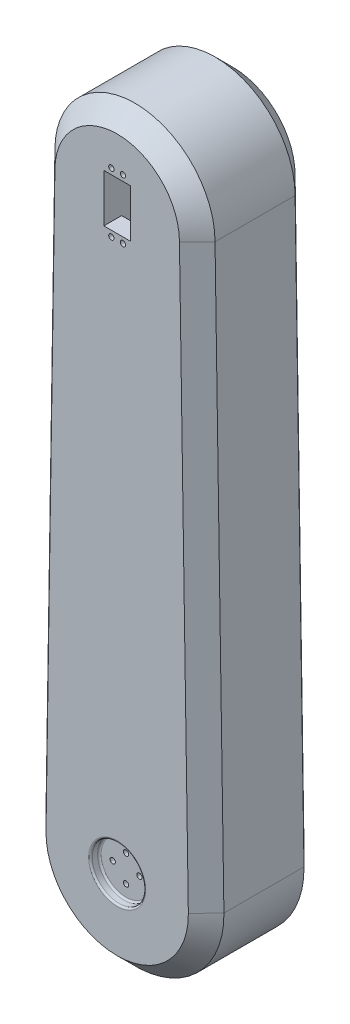
ISO-10303-21;
HEADER;
FILE_DESCRIPTION(('STEP AP214'),'2;1');
FILE_NAME('part.step','',(''),(''),'','','');
FILE_SCHEMA(('AUTOMOTIVE_DESIGN { 1 0 10303 214 1 1 1 1 }'));
ENDSEC;
DATA;
#1=APPLICATION_CONTEXT('core data for automotive mechanical design processes');
#2=APPLICATION_PROTOCOL_DEFINITION('international standard','automotive_design',2000,#1);
#3=PRODUCT_CONTEXT('',#1,'mechanical');
#4=PRODUCT('Part','Part','',(#3));
#5=PRODUCT_RELATED_PRODUCT_CATEGORY('part','',(#4));
#6=PRODUCT_DEFINITION_FORMATION('','',#4);
#7=PRODUCT_DEFINITION_CONTEXT('part definition',#1,'design');
#8=PRODUCT_DEFINITION('design','',#6,#7);
#9=PRODUCT_DEFINITION_SHAPE('','',#8);
#10=(LENGTH_UNIT() NAMED_UNIT(*) SI_UNIT(.MILLI.,.METRE.));
#11=(NAMED_UNIT(*) PLANE_ANGLE_UNIT() SI_UNIT($,.RADIAN.));
#12=(NAMED_UNIT(*) SI_UNIT($,.STERADIAN.) SOLID_ANGLE_UNIT());
#13=UNCERTAINTY_MEASURE_WITH_UNIT(LENGTH_MEASURE(1.E-05),#10,'distance_accuracy_value','');
#14=(GEOMETRIC_REPRESENTATION_CONTEXT(3) GLOBAL_UNCERTAINTY_ASSIGNED_CONTEXT((#13)) GLOBAL_UNIT_ASSIGNED_CONTEXT((#10,
#11,#12)) REPRESENTATION_CONTEXT('',''));
#15=CARTESIAN_POINT('',(0.,0.,0.));
#16=DIRECTION('',(0.,0.,1.));
#17=DIRECTION('',(1.,0.,0.));
#18=AXIS2_PLACEMENT_3D('',#15,#16,#17);
#19=CARTESIAN_POINT('',(0.,325.,65.));
#20=DIRECTION('',(0.,0.,1.));
#21=DIRECTION('',(1.,0.,0.));
#22=AXIS2_PLACEMENT_3D('',#19,#20,#21);
#23=PLANE('',#22);
#24=CARTESIAN_POINT('',(-3.25,308.25,65.));
#25=DIRECTION('',(0.,0.,-1.));
#26=DIRECTION('',(-1.,0.,0.));
#27=AXIS2_PLACEMENT_3D('',#24,#25,#26);
#28=CIRCLE('',#27,1.5);
#29=CARTESIAN_POINT('',(-4.75000000000001,308.25,65.));
#30=VERTEX_POINT('',#29);
#31=EDGE_CURVE('E719',#30,#30,#28,.T.);
#32=ORIENTED_EDGE('',*,*,#31,.T.);
#33=EDGE_LOOP('',(#32));
#34=FACE_BOUND('',#33,.T.);
#35=CARTESIAN_POINT('',(-3.25,341.75,65.));
#36=DIRECTION('',(0.,0.,-1.));
#37=DIRECTION('',(-1.,0.,0.));
#38=AXIS2_PLACEMENT_3D('',#35,#36,#37);
#39=CIRCLE('',#38,1.5);
#40=CARTESIAN_POINT('',(-4.75000000000001,341.75,65.));
#41=VERTEX_POINT('',#40);
#42=EDGE_CURVE('E707',#41,#41,#39,.F.);
#43=ORIENTED_EDGE('',*,*,#42,.F.);
#44=EDGE_LOOP('',(#43));
#45=FACE_BOUND('',#44,.T.);
#46=CARTESIAN_POINT('',(3.25,341.75,65.));
#47=DIRECTION('',(0.,0.,-1.));
#48=DIRECTION('',(-1.,0.,0.));
#49=AXIS2_PLACEMENT_3D('',#46,#47,#48);
#50=CIRCLE('',#49,1.5);
#51=CARTESIAN_POINT('',(1.74999999999999,341.75,65.));
#52=VERTEX_POINT('',#51);
#53=EDGE_CURVE('E183',#52,#52,#50,.T.);
#54=ORIENTED_EDGE('',*,*,#53,.T.);
#55=EDGE_LOOP('',(#54));
#56=FACE_BOUND('',#55,.T.);
#57=CARTESIAN_POINT('',(0.,0.,65.));
#58=DIRECTION('',(0.,0.,1.));
#59=DIRECTION('',(1.,0.,0.));
#60=AXIS2_PLACEMENT_3D('',#57,#58,#59);
#61=CIRCLE('',#60,16.);
#62=CARTESIAN_POINT('',(16.,0.,65.));
#63=VERTEX_POINT('',#62);
#64=EDGE_CURVE('E49',#63,#63,#61,.F.);
#65=ORIENTED_EDGE('',*,*,#64,.T.);
#66=EDGE_LOOP('',(#65));
#67=FACE_BOUND('',#66,.T.);
#68=DIRECTION('',(-0.0154010373396947,-0.999881396991094,0.));
#69=VECTOR('',#68,1.);
#70=CARTESIAN_POINT('',(-39.9952558796438,0.616041493587782,65.));
#71=LINE('',#70,#69);
#72=CARTESIAN_POINT('',(-34.9999255762725,324.927822057446,65.));
#73=VERTEX_POINT('',#72);
#74=CARTESIAN_POINT('',(-39.9952558796438,0.616041493587784,65.));
#75=VERTEX_POINT('',#74);
#76=EDGE_CURVE('E291',#73,#75,#71,.T.);
#77=ORIENTED_EDGE('',*,*,#76,.T.);
#78=CARTESIAN_POINT('',(0.,0.,65.));
#79=DIRECTION('',(0.,0.,1.));
#80=DIRECTION('',(1.,0.,0.));
#81=AXIS2_PLACEMENT_3D('',#78,#79,#80);
#82=CIRCLE('',#81,40.);
#83=CARTESIAN_POINT('',(39.9952558796438,0.616041493587789,65.));
#84=VERTEX_POINT('',#83);
#85=EDGE_CURVE('E293',#75,#84,#82,.T.);
#86=ORIENTED_EDGE('',*,*,#85,.T.);
#87=DIRECTION('',(-0.0154010373396947,0.999881396991094,0.));
#88=VECTOR('',#87,1.);
#89=CARTESIAN_POINT('',(35.0011860300891,324.845989626603,65.));
#90=LINE('',#89,#88);
#91=CARTESIAN_POINT('',(34.9999255762725,324.927822057446,65.));
#92=VERTEX_POINT('',#91);
#93=EDGE_CURVE('E287',#84,#92,#90,.T.);
#94=ORIENTED_EDGE('',*,*,#93,.T.);
#95=CARTESIAN_POINT('',(0.,325.,65.));
#96=DIRECTION('',(0.,0.,1.));
#97=DIRECTION('',(1.,0.,0.));
#98=AXIS2_PLACEMENT_3D('',#95,#96,#97);
#99=CIRCLE('',#98,35.);
#100=EDGE_CURVE('E289',#92,#73,#99,.T.);
#101=ORIENTED_EDGE('',*,*,#100,.T.);
#102=EDGE_LOOP('',(#77,#86,#94,#101));
#103=FACE_BOUND('',#102,.T.);
#104=DIRECTION('',(0.,-1.,0.));
#105=VECTOR('',#104,1.);
#106=CARTESIAN_POINT('',(7.49999999999996,0.,65.));
#107=LINE('',#106,#105);
#108=CARTESIAN_POINT('',(7.5,338.5,65.));
#109=VERTEX_POINT('',#108);
#110=CARTESIAN_POINT('',(7.5,311.5,65.));
#111=VERTEX_POINT('',#110);
#112=EDGE_CURVE('E161',#109,#111,#107,.T.);
#113=ORIENTED_EDGE('',*,*,#112,.T.);
#114=DIRECTION('',(1.,0.,0.));
#115=VECTOR('',#114,1.);
#116=CARTESIAN_POINT('',(0.,311.5,65.));
#117=LINE('',#116,#115);
#118=CARTESIAN_POINT('',(-7.5,311.5,65.));
#119=VERTEX_POINT('',#118);
#120=EDGE_CURVE('E156',#119,#111,#117,.T.);
#121=ORIENTED_EDGE('',*,*,#120,.F.);
#122=DIRECTION('',(0.,1.,0.));
#123=VECTOR('',#122,1.);
#124=CARTESIAN_POINT('',(-7.50000000000003,0.,65.));
#125=LINE('',#124,#123);
#126=CARTESIAN_POINT('',(-7.5,338.5,65.));
#127=VERTEX_POINT('',#126);
#128=EDGE_CURVE('E164',#119,#127,#125,.T.);
#129=ORIENTED_EDGE('',*,*,#128,.T.);
#130=DIRECTION('',(-1.,0.,0.));
#131=VECTOR('',#130,1.);
#132=CARTESIAN_POINT('',(0.,338.5,65.));
#133=LINE('',#132,#131);
#134=EDGE_CURVE('E169',#109,#127,#133,.T.);
#135=ORIENTED_EDGE('',*,*,#134,.F.);
#136=EDGE_LOOP('',(#113,#121,#129,#135));
#137=FACE_BOUND('',#136,.T.);
#138=CARTESIAN_POINT('',(3.25,308.25,65.));
#139=DIRECTION('',(0.,0.,-1.));
#140=DIRECTION('',(-1.,0.,0.));
#141=AXIS2_PLACEMENT_3D('',#138,#139,#140);
#142=CIRCLE('',#141,1.5);
#143=CARTESIAN_POINT('',(1.74999999999999,308.25,65.));
#144=VERTEX_POINT('',#143);
#145=EDGE_CURVE('E708',#144,#144,#142,.F.);
#146=ORIENTED_EDGE('',*,*,#145,.F.);
#147=EDGE_LOOP('',(#146));
#148=FACE_BOUND('',#147,.T.);
#149=ADVANCED_FACE('F41',(#34,#45,#56,#67,#103,#137,#148),#23,.T.);
#150=CARTESIAN_POINT('',(0.,325.,55.));
#151=DIRECTION('',(0.,0.,1.));
#152=DIRECTION('',(1.,0.,0.));
#153=AXIS2_PLACEMENT_3D('',#150,#151,#152);
#154=PLANE('',#153);
#155=CARTESIAN_POINT('',(3.25,308.25,55.));
#156=DIRECTION('',(0.,0.,-1.));
#157=DIRECTION('',(-1.,0.,0.));
#158=AXIS2_PLACEMENT_3D('',#155,#156,#157);
#159=CIRCLE('',#158,1.5);
#160=CARTESIAN_POINT('',(1.74999999999999,308.25,55.));
#161=VERTEX_POINT('',#160);
#162=EDGE_CURVE('E714',#161,#161,#159,.F.);
#163=ORIENTED_EDGE('',*,*,#162,.T.);
#164=EDGE_LOOP('',(#163));
#165=FACE_BOUND('',#164,.T.);
#166=CARTESIAN_POINT('',(-3.25,308.25,55.));
#167=DIRECTION('',(0.,0.,-1.));
#168=DIRECTION('',(-1.,0.,0.));
#169=AXIS2_PLACEMENT_3D('',#166,#167,#168);
#170=CIRCLE('',#169,1.5);
#171=CARTESIAN_POINT('',(-4.75000000000001,308.25,55.));
#172=VERTEX_POINT('',#171);
#173=EDGE_CURVE('E178',#172,#172,#170,.T.);
#174=ORIENTED_EDGE('',*,*,#173,.F.);
#175=EDGE_LOOP('',(#174));
#176=FACE_BOUND('',#175,.T.);
#177=DIRECTION('',(0.,1.,0.));
#178=VECTOR('',#177,1.);
#179=CARTESIAN_POINT('',(-7.5,345.,55.));
#180=LINE('',#179,#178);
#181=CARTESIAN_POINT('',(-7.5,305.,55.));
#182=VERTEX_POINT('',#181);
#183=CARTESIAN_POINT('',(-7.5,311.5,55.));
#184=VERTEX_POINT('',#183);
#185=EDGE_CURVE('E205',#182,#184,#180,.T.);
#186=ORIENTED_EDGE('',*,*,#185,.T.);
#187=DIRECTION('',(1.,0.,0.));
#188=VECTOR('',#187,1.);
#189=CARTESIAN_POINT('',(0.,311.5,55.));
#190=LINE('',#189,#188);
#191=CARTESIAN_POINT('',(7.5,311.5,55.));
#192=VERTEX_POINT('',#191);
#193=EDGE_CURVE('E159',#184,#192,#190,.T.);
#194=ORIENTED_EDGE('',*,*,#193,.T.);
#195=DIRECTION('',(0.,-1.,0.));
#196=VECTOR('',#195,1.);
#197=CARTESIAN_POINT('',(7.5,345.,55.));
#198=LINE('',#197,#196);
#199=CARTESIAN_POINT('',(7.5,305.,55.));
#200=VERTEX_POINT('',#199);
#201=EDGE_CURVE('E217',#192,#200,#198,.T.);
#202=ORIENTED_EDGE('',*,*,#201,.T.);
#203=DIRECTION('',(-1.,0.,0.));
#204=VECTOR('',#203,1.);
#205=CARTESIAN_POINT('',(7.5,305.,55.));
#206=LINE('',#205,#204);
#207=EDGE_CURVE('E209',#200,#182,#206,.T.);
#208=ORIENTED_EDGE('',*,*,#207,.T.);
#209=EDGE_LOOP('',(#186,#194,#202,#208));
#210=FACE_BOUND('',#209,.T.);
#211=ADVANCED_FACE('F391',(#165,#176,#210),#154,.F.);
#212=CARTESIAN_POINT('',(3.25,341.75,55.));
#213=DIRECTION('',(0.,0.,-1.));
#214=DIRECTION('',(-1.,0.,0.));
#215=AXIS2_PLACEMENT_3D('',#212,#213,#214);
#216=CIRCLE('',#215,1.5);
#217=CARTESIAN_POINT('',(1.74999999999999,341.75,55.));
#218=VERTEX_POINT('',#217);
#219=EDGE_CURVE('E711',#218,#218,#216,.T.);
#220=ORIENTED_EDGE('',*,*,#219,.F.);
#221=EDGE_LOOP('',(#220));
#222=FACE_BOUND('',#221,.T.);
#223=CARTESIAN_POINT('',(7.5,345.,55.));
#224=VERTEX_POINT('',#223);
#225=CARTESIAN_POINT('',(7.5,338.5,55.));
#226=VERTEX_POINT('',#225);
#227=EDGE_CURVE('E214',#224,#226,#198,.T.);
#228=ORIENTED_EDGE('',*,*,#227,.T.);
#229=DIRECTION('',(-1.,0.,0.));
#230=VECTOR('',#229,1.);
#231=CARTESIAN_POINT('',(0.,338.5,55.));
#232=LINE('',#231,#230);
#233=CARTESIAN_POINT('',(-7.5,338.5,55.));
#234=VERTEX_POINT('',#233);
#235=EDGE_CURVE('E174',#226,#234,#232,.T.);
#236=ORIENTED_EDGE('',*,*,#235,.T.);
#237=CARTESIAN_POINT('',(-7.5,345.,55.));
#238=VERTEX_POINT('',#237);
#239=EDGE_CURVE('E208',#234,#238,#180,.T.);
#240=ORIENTED_EDGE('',*,*,#239,.T.);
#241=DIRECTION('',(1.,0.,0.));
#242=VECTOR('',#241,1.);
#243=CARTESIAN_POINT('',(7.5,345.,55.));
#244=LINE('',#243,#242);
#245=EDGE_CURVE('E193',#238,#224,#244,.T.);
#246=ORIENTED_EDGE('',*,*,#245,.T.);
#247=EDGE_LOOP('',(#228,#236,#240,#246));
#248=FACE_BOUND('',#247,.T.);
#249=CARTESIAN_POINT('',(-3.25,341.75,55.));
#250=DIRECTION('',(0.,0.,-1.));
#251=DIRECTION('',(-1.,0.,0.));
#252=AXIS2_PLACEMENT_3D('',#249,#250,#251);
#253=CIRCLE('',#252,1.5);
#254=CARTESIAN_POINT('',(-4.75000000000001,341.75,55.));
#255=VERTEX_POINT('',#254);
#256=EDGE_CURVE('E705',#255,#255,#253,.F.);
#257=ORIENTED_EDGE('',*,*,#256,.T.);
#258=EDGE_LOOP('',(#257));
#259=FACE_BOUND('',#258,.T.);
#260=ADVANCED_FACE('F397',(#222,#248,#259),#154,.F.);
#261=CARTESIAN_POINT('',(0.,325.,65.));
#262=DIRECTION('',(0.,0.,-1.));
#263=DIRECTION('',(-1.,0.,0.));
#264=AXIS2_PLACEMENT_3D('',#261,#262,#263);
#265=CYLINDRICAL_SURFACE('',#264,45.);
#266=DIRECTION('',(0.,0.,-1.));
#267=VECTOR('',#266,1.);
#268=CARTESIAN_POINT('',(45.,325.,65.));
#269=LINE('',#268,#267);
#270=CARTESIAN_POINT('',(45.,325.,55.));
#271=VERTEX_POINT('',#270);
#272=CARTESIAN_POINT('',(45.,325.,10.0000000000001));
#273=VERTEX_POINT('',#272);
#274=EDGE_CURVE('E226',#271,#273,#269,.T.);
#275=ORIENTED_EDGE('',*,*,#274,.T.);
#276=CARTESIAN_POINT('',(0.,325.,10.0000000000001));
#277=DIRECTION('',(0.,0.,1.));
#278=DIRECTION('',(1.,0.,0.));
#279=AXIS2_PLACEMENT_3D('',#276,#277,#278);
#280=CIRCLE('',#279,45.);
#281=CARTESIAN_POINT('',(-45.,325.,10.0000000000001));
#282=VERTEX_POINT('',#281);
#283=EDGE_CURVE('E281',#273,#282,#280,.T.);
#284=ORIENTED_EDGE('',*,*,#283,.T.);
#285=DIRECTION('',(0.,0.,-1.));
#286=VECTOR('',#285,1.);
#287=CARTESIAN_POINT('',(-45.,325.,65.));
#288=LINE('',#287,#286);
#289=CARTESIAN_POINT('',(-45.,325.,55.));
#290=VERTEX_POINT('',#289);
#291=EDGE_CURVE('E257',#290,#282,#288,.T.);
#292=ORIENTED_EDGE('',*,*,#291,.F.);
#293=CARTESIAN_POINT('',(0.,325.,55.));
#294=DIRECTION('',(0.,0.,1.));
#295=DIRECTION('',(1.,0.,0.));
#296=AXIS2_PLACEMENT_3D('',#293,#294,#295);
#297=CIRCLE('',#296,45.);
#298=EDGE_CURVE('E279',#290,#271,#297,.F.);
#299=ORIENTED_EDGE('',*,*,#298,.T.);
#300=EDGE_LOOP('',(#275,#284,#292,#299));
#301=FACE_BOUND('',#300,.T.);
#302=ADVANCED_FACE('F421',(#301),#265,.T.);
#303=CARTESIAN_POINT('',(-45.,325.,65.));
#304=DIRECTION('',(0.999881396991094,-0.0154010373396947,0.));
#305=DIRECTION('',(0.0154010373396947,0.999881396991094,0.));
#306=AXIS2_PLACEMENT_3D('',#303,#304,#305);
#307=PLANE('',#306);
#308=ORIENTED_EDGE('',*,*,#291,.T.);
#309=DIRECTION('',(-0.0154010373396947,-0.999881396991094,0.));
#310=VECTOR('',#309,1.);
#311=CARTESIAN_POINT('',(-45.,325.,10.0000000000001));
#312=LINE('',#311,#310);
#313=CARTESIAN_POINT('',(-49.9940698495547,0.770051866984729,10.0000000000001));
#314=VERTEX_POINT('',#313);
#315=EDGE_CURVE('E277',#282,#314,#312,.T.);
#316=ORIENTED_EDGE('',*,*,#315,.T.);
#317=DIRECTION('',(0.,0.,-1.));
#318=VECTOR('',#317,1.);
#319=CARTESIAN_POINT('',(-49.9940698495547,0.770051866984729,65.));
#320=LINE('',#319,#318);
#321=CARTESIAN_POINT('',(-49.9940698495547,0.770051866984729,55.));
#322=VERTEX_POINT('',#321);
#323=EDGE_CURVE('E254',#322,#314,#320,.T.);
#324=ORIENTED_EDGE('',*,*,#323,.F.);
#325=DIRECTION('',(0.0154010373396947,0.999881396991094,0.));
#326=VECTOR('',#325,1.);
#327=CARTESIAN_POINT('',(-45.,325.,55.));
#328=LINE('',#327,#326);
#329=EDGE_CURVE('E275',#322,#290,#328,.T.);
#330=ORIENTED_EDGE('',*,*,#329,.T.);
#331=EDGE_LOOP('',(#308,#316,#324,#330));
#332=FACE_BOUND('',#331,.T.);
#333=ADVANCED_FACE('F417',(#332),#307,.F.);
#334=CARTESIAN_POINT('',(0.,0.,65.));
#335=DIRECTION('',(0.,0.,-1.));
#336=DIRECTION('',(-1.,0.,0.));
#337=AXIS2_PLACEMENT_3D('',#334,#335,#336);
#338=CYLINDRICAL_SURFACE('',#337,50.);
#339=ORIENTED_EDGE('',*,*,#323,.T.);
#340=CARTESIAN_POINT('',(0.,0.,10.0000000000001));
#341=DIRECTION('',(0.,0.,1.));
#342=DIRECTION('',(1.,0.,0.));
#343=AXIS2_PLACEMENT_3D('',#340,#341,#342);
#344=CIRCLE('',#343,50.);
#345=CARTESIAN_POINT('',(49.9940698495547,0.770051866984735,10.0000000000001));
#346=VERTEX_POINT('',#345);
#347=EDGE_CURVE('E263',#314,#346,#344,.T.);
#348=ORIENTED_EDGE('',*,*,#347,.T.);
#349=DIRECTION('',(0.,0.,-1.));
#350=VECTOR('',#349,1.);
#351=CARTESIAN_POINT('',(49.9940698495547,0.770051866984735,65.));
#352=LINE('',#351,#350);
#353=CARTESIAN_POINT('',(49.9940698495547,0.770051866984735,55.));
#354=VERTEX_POINT('',#353);
#355=EDGE_CURVE('E251',#354,#346,#352,.T.);
#356=ORIENTED_EDGE('',*,*,#355,.F.);
#357=CARTESIAN_POINT('',(0.,0.,55.));
#358=DIRECTION('',(0.,0.,1.));
#359=DIRECTION('',(1.,0.,0.));
#360=AXIS2_PLACEMENT_3D('',#357,#358,#359);
#361=CIRCLE('',#360,50.);
#362=EDGE_CURVE('E260',#354,#322,#361,.F.);
#363=ORIENTED_EDGE('',*,*,#362,.T.);
#364=EDGE_LOOP('',(#339,#348,#356,#363));
#365=FACE_BOUND('',#364,.T.);
#366=ADVANCED_FACE('F413',(#365),#338,.T.);
#367=CARTESIAN_POINT('',(45.,325.,65.));
#368=DIRECTION('',(-0.999881396991094,-0.0154010373396947,0.));
#369=DIRECTION('',(0.0154010373396947,-0.999881396991094,0.));
#370=AXIS2_PLACEMENT_3D('',#367,#368,#369);
#371=PLANE('',#370);
#372=ORIENTED_EDGE('',*,*,#355,.T.);
#373=DIRECTION('',(-0.0154010373396947,0.999881396991094,0.));
#374=VECTOR('',#373,1.);
#375=CARTESIAN_POINT('',(45.,325.,10.0000000000001));
#376=LINE('',#375,#374);
#377=EDGE_CURVE('E285',#346,#273,#376,.T.);
#378=ORIENTED_EDGE('',*,*,#377,.T.);
#379=ORIENTED_EDGE('',*,*,#274,.F.);
#380=DIRECTION('',(0.0154010373396947,-0.999881396991094,0.));
#381=VECTOR('',#380,1.);
#382=CARTESIAN_POINT('',(49.9940698495547,0.770051866984735,55.));
#383=LINE('',#382,#381);
#384=EDGE_CURVE('E283',#271,#354,#383,.T.);
#385=ORIENTED_EDGE('',*,*,#384,.T.);
#386=EDGE_LOOP('',(#372,#378,#379,#385));
#387=FACE_BOUND('',#386,.T.);
#388=ADVANCED_FACE('F409',(#387),#371,.F.);
#389=CARTESIAN_POINT('',(0.,325.,0.));
#390=DIRECTION('',(0.,0.,1.));
#391=DIRECTION('',(1.,0.,0.));
#392=AXIS2_PLACEMENT_3D('',#389,#390,#391);
#393=PLANE('',#392);
#394=DIRECTION('',(0.,-1.,0.));
#395=VECTOR('',#394,1.);
#396=CARTESIAN_POINT('',(7.5,345.,0.));
#397=LINE('',#396,#395);
#398=CARTESIAN_POINT('',(7.5,345.,0.));
#399=VERTEX_POINT('',#398);
#400=CARTESIAN_POINT('',(7.5,305.,0.));
#401=VERTEX_POINT('',#400);
#402=EDGE_CURVE('E194',#399,#401,#397,.T.);
#403=ORIENTED_EDGE('',*,*,#402,.F.);
#404=DIRECTION('',(1.,0.,0.));
#405=VECTOR('',#404,1.);
#406=CARTESIAN_POINT('',(7.5,345.,0.));
#407=LINE('',#406,#405);
#408=CARTESIAN_POINT('',(-7.5,345.,0.));
#409=VERTEX_POINT('',#408);
#410=EDGE_CURVE('E197',#409,#399,#407,.T.);
#411=ORIENTED_EDGE('',*,*,#410,.F.);
#412=DIRECTION('',(0.,1.,0.));
#413=VECTOR('',#412,1.);
#414=CARTESIAN_POINT('',(-7.5,345.,0.));
#415=LINE('',#414,#413);
#416=CARTESIAN_POINT('',(-7.5,305.,0.));
#417=VERTEX_POINT('',#416);
#418=EDGE_CURVE('E187',#417,#409,#415,.T.);
#419=ORIENTED_EDGE('',*,*,#418,.F.);
#420=DIRECTION('',(-1.,0.,0.));
#421=VECTOR('',#420,1.);
#422=CARTESIAN_POINT('',(7.5,305.,0.));
#423=LINE('',#422,#421);
#424=EDGE_CURVE('E191',#401,#417,#423,.T.);
#425=ORIENTED_EDGE('',*,*,#424,.F.);
#426=EDGE_LOOP('',(#403,#411,#419,#425));
#427=FACE_BOUND('',#426,.T.);
#428=DIRECTION('',(0.0154010373396947,-0.999881396991094,0.));
#429=VECTOR('',#428,1.);
#430=CARTESIAN_POINT('',(34.9905123922877,325.538954109468,0.));
#431=LINE('',#430,#429);
#432=CARTESIAN_POINT('',(34.9999255762723,324.927822057446,0.));
#433=VERTEX_POINT('',#432);
#434=CARTESIAN_POINT('',(39.9952558796436,0.616041493587786,0.));
#435=VERTEX_POINT('',#434);
#436=EDGE_CURVE('E266',#433,#435,#431,.T.);
#437=ORIENTED_EDGE('',*,*,#436,.T.);
#438=CARTESIAN_POINT('',(0.,0.,0.));
#439=DIRECTION('',(0.,0.,1.));
#440=DIRECTION('',(1.,0.,0.));
#441=AXIS2_PLACEMENT_3D('',#438,#439,#440);
#442=CIRCLE('',#441,39.9999999999998);
#443=CARTESIAN_POINT('',(-39.9952558796436,0.616041493587781,0.));
#444=VERTEX_POINT('',#443);
#445=EDGE_CURVE('E272',#435,#444,#442,.F.);
#446=ORIENTED_EDGE('',*,*,#445,.T.);
#447=DIRECTION('',(0.0154010373396947,0.999881396991094,0.));
#448=VECTOR('',#447,1.);
#449=CARTESIAN_POINT('',(-34.9905123922877,325.538954109468,0.));
#450=LINE('',#449,#448);
#451=CARTESIAN_POINT('',(-34.9999255762723,324.927822057446,0.));
#452=VERTEX_POINT('',#451);
#453=EDGE_CURVE('E270',#444,#452,#450,.T.);
#454=ORIENTED_EDGE('',*,*,#453,.T.);
#455=CARTESIAN_POINT('',(0.,325.,0.));
#456=DIRECTION('',(0.,0.,1.));
#457=DIRECTION('',(1.,0.,0.));
#458=AXIS2_PLACEMENT_3D('',#455,#456,#457);
#459=CIRCLE('',#458,34.9999999999999);
#460=EDGE_CURVE('E268',#452,#433,#459,.F.);
#461=ORIENTED_EDGE('',*,*,#460,.T.);
#462=EDGE_LOOP('',(#437,#446,#454,#461));
#463=FACE_BOUND('',#462,.T.);
#464=ADVANCED_FACE('F406',(#427,#463),#393,.F.);
#465=CARTESIAN_POINT('',(0.,0.,60.));
#466=DIRECTION('',(0.,0.,1.));
#467=DIRECTION('',(1.,0.,0.));
#468=AXIS2_PLACEMENT_3D('',#465,#466,#467);
#469=CYLINDRICAL_SURFACE('',#468,15.);
#470=CARTESIAN_POINT('',(0.,0.,64.));
#471=DIRECTION('',(0.,0.,1.));
#472=DIRECTION('',(1.,0.,0.));
#473=AXIS2_PLACEMENT_3D('',#470,#471,#472);
#474=CIRCLE('',#473,15.);
#475=CARTESIAN_POINT('',(15.,0.,64.));
#476=VERTEX_POINT('',#475);
#477=EDGE_CURVE('E530',#476,#476,#474,.T.);
#478=ORIENTED_EDGE('',*,*,#477,.T.);
#479=EDGE_LOOP('',(#478));
#480=FACE_BOUND('',#479,.T.);
#481=CARTESIAN_POINT('',(0.,0.,61.));
#482=DIRECTION('',(0.,0.,1.));
#483=DIRECTION('',(1.,0.,0.));
#484=AXIS2_PLACEMENT_3D('',#481,#482,#483);
#485=CIRCLE('',#484,15.);
#486=CARTESIAN_POINT('',(15.,0.,61.));
#487=VERTEX_POINT('',#486);
#488=EDGE_CURVE('E296',#487,#487,#485,.F.);
#489=ORIENTED_EDGE('',*,*,#488,.T.);
#490=EDGE_LOOP('',(#489));
#491=FACE_BOUND('',#490,.T.);
#492=ADVANCED_FACE('F404',(#480,#491),#469,.F.);
#493=CARTESIAN_POINT('',(0.,0.,60.));
#494=DIRECTION('',(0.,0.,1.));
#495=DIRECTION('',(1.,0.,0.));
#496=AXIS2_PLACEMENT_3D('',#493,#494,#495);
#497=PLANE('',#496);
#498=CARTESIAN_POINT('',(0.,0.,60.));
#499=DIRECTION('',(0.,0.,1.));
#500=DIRECTION('',(1.,0.,0.));
#501=AXIS2_PLACEMENT_3D('',#498,#499,#500);
#502=CIRCLE('',#501,14.);
#503=CARTESIAN_POINT('',(14.,0.,60.));
#504=VERTEX_POINT('',#503);
#505=EDGE_CURVE('E12',#504,#504,#502,.T.);
#506=ORIENTED_EDGE('',*,*,#505,.T.);
#507=EDGE_LOOP('',(#506));
#508=FACE_BOUND('',#507,.T.);
#509=CARTESIAN_POINT('',(0.,7.5,60.));
#510=DIRECTION('',(0.,0.,1.));
#511=DIRECTION('',(1.,0.,0.));
#512=AXIS2_PLACEMENT_3D('',#509,#510,#511);
#513=CIRCLE('',#512,1.5);
#514=CARTESIAN_POINT('',(1.5,7.5,60.));
#515=VERTEX_POINT('',#514);
#516=EDGE_CURVE('E227',#515,#515,#513,.T.);
#517=ORIENTED_EDGE('',*,*,#516,.F.);
#518=EDGE_LOOP('',(#517));
#519=FACE_BOUND('',#518,.T.);
#520=CARTESIAN_POINT('',(7.5,0.,60.));
#521=DIRECTION('',(0.,0.,1.));
#522=DIRECTION('',(1.,0.,0.));
#523=AXIS2_PLACEMENT_3D('',#520,#521,#522);
#524=CIRCLE('',#523,1.5);
#525=CARTESIAN_POINT('',(9.,0.,60.));
#526=VERTEX_POINT('',#525);
#527=EDGE_CURVE('E230',#526,#526,#524,.T.);
#528=ORIENTED_EDGE('',*,*,#527,.F.);
#529=EDGE_LOOP('',(#528));
#530=FACE_BOUND('',#529,.T.);
#531=CARTESIAN_POINT('',(0.,-7.5,60.));
#532=DIRECTION('',(0.,0.,1.));
#533=DIRECTION('',(1.,0.,0.));
#534=AXIS2_PLACEMENT_3D('',#531,#532,#533);
#535=CIRCLE('',#534,1.50000000000005);
#536=CARTESIAN_POINT('',(1.50000000000005,-7.5,60.));
#537=VERTEX_POINT('',#536);
#538=EDGE_CURVE('E236',#537,#537,#535,.T.);
#539=ORIENTED_EDGE('',*,*,#538,.F.);
#540=EDGE_LOOP('',(#539));
#541=FACE_BOUND('',#540,.T.);
#542=CARTESIAN_POINT('',(-7.5,0.,60.));
#543=DIRECTION('',(0.,0.,1.));
#544=DIRECTION('',(1.,0.,0.));
#545=AXIS2_PLACEMENT_3D('',#542,#543,#544);
#546=CIRCLE('',#545,1.5);
#547=CARTESIAN_POINT('',(-6.,0.,60.));
#548=VERTEX_POINT('',#547);
#549=EDGE_CURVE('E242',#548,#548,#546,.T.);
#550=ORIENTED_EDGE('',*,*,#549,.F.);
#551=EDGE_LOOP('',(#550));
#552=FACE_BOUND('',#551,.T.);
#553=ADVANCED_FACE('F501',(#508,#519,#530,#541,#552),#497,.T.);
#554=CARTESIAN_POINT('',(-7.5,0.,52.5));
#555=DIRECTION('',(0.,0.,1.));
#556=DIRECTION('',(1.,0.,0.));
#557=AXIS2_PLACEMENT_3D('',#554,#555,#556);
#558=CYLINDRICAL_SURFACE('',#557,1.5);
#559=CARTESIAN_POINT('',(-7.5,0.,52.5));
#560=DIRECTION('',(0.,0.,1.));
#561=DIRECTION('',(1.,0.,0.));
#562=AXIS2_PLACEMENT_3D('',#559,#560,#561);
#563=CIRCLE('',#562,1.5);
#564=CARTESIAN_POINT('',(-6.,0.,52.5));
#565=VERTEX_POINT('',#564);
#566=EDGE_CURVE('E245',#565,#565,#563,.T.);
#567=ORIENTED_EDGE('',*,*,#566,.F.);
#568=EDGE_LOOP('',(#567));
#569=FACE_BOUND('',#568,.T.);
#570=ORIENTED_EDGE('',*,*,#549,.T.);
#571=EDGE_LOOP('',(#570));
#572=FACE_BOUND('',#571,.T.);
#573=ADVANCED_FACE('F498',(#569,#572),#558,.F.);
#574=CARTESIAN_POINT('',(-7.5,0.,52.5));
#575=DIRECTION('',(0.,0.,1.));
#576=DIRECTION('',(1.,0.,0.));
#577=AXIS2_PLACEMENT_3D('',#574,#575,#576);
#578=PLANE('',#577);
#579=ORIENTED_EDGE('',*,*,#566,.T.);
#580=EDGE_LOOP('',(#579));
#581=FACE_BOUND('',#580,.T.);
#582=ADVANCED_FACE('F493',(#581),#578,.T.);
#583=CARTESIAN_POINT('',(0.,-7.5,52.5));
#584=DIRECTION('',(0.,0.,1.));
#585=DIRECTION('',(1.,0.,0.));
#586=AXIS2_PLACEMENT_3D('',#583,#584,#585);
#587=CYLINDRICAL_SURFACE('',#586,1.50000000000005);
#588=CARTESIAN_POINT('',(0.,-7.5,52.5));
#589=DIRECTION('',(0.,0.,1.));
#590=DIRECTION('',(1.,0.,0.));
#591=AXIS2_PLACEMENT_3D('',#588,#589,#590);
#592=CIRCLE('',#591,1.50000000000005);
#593=CARTESIAN_POINT('',(1.50000000000005,-7.5,52.5));
#594=VERTEX_POINT('',#593);
#595=EDGE_CURVE('E239',#594,#594,#592,.T.);
#596=ORIENTED_EDGE('',*,*,#595,.F.);
#597=EDGE_LOOP('',(#596));
#598=FACE_BOUND('',#597,.T.);
#599=ORIENTED_EDGE('',*,*,#538,.T.);
#600=EDGE_LOOP('',(#599));
#601=FACE_BOUND('',#600,.T.);
#602=ADVANCED_FACE('F490',(#598,#601),#587,.F.);
#603=CARTESIAN_POINT('',(0.,-7.5,52.5));
#604=DIRECTION('',(0.,0.,1.));
#605=DIRECTION('',(1.,0.,0.));
#606=AXIS2_PLACEMENT_3D('',#603,#604,#605);
#607=PLANE('',#606);
#608=ORIENTED_EDGE('',*,*,#595,.T.);
#609=EDGE_LOOP('',(#608));
#610=FACE_BOUND('',#609,.T.);
#611=ADVANCED_FACE('F485',(#610),#607,.T.);
#612=CARTESIAN_POINT('',(7.5,0.,52.5));
#613=DIRECTION('',(0.,0.,1.));
#614=DIRECTION('',(1.,0.,0.));
#615=AXIS2_PLACEMENT_3D('',#612,#613,#614);
#616=CYLINDRICAL_SURFACE('',#615,1.5);
#617=CARTESIAN_POINT('',(7.5,0.,52.5));
#618=DIRECTION('',(0.,0.,1.));
#619=DIRECTION('',(1.,0.,0.));
#620=AXIS2_PLACEMENT_3D('',#617,#618,#619);
#621=CIRCLE('',#620,1.5);
#622=CARTESIAN_POINT('',(9.,0.,52.5));
#623=VERTEX_POINT('',#622);
#624=EDGE_CURVE('E233',#623,#623,#621,.T.);
#625=ORIENTED_EDGE('',*,*,#624,.F.);
#626=EDGE_LOOP('',(#625));
#627=FACE_BOUND('',#626,.T.);
#628=ORIENTED_EDGE('',*,*,#527,.T.);
#629=EDGE_LOOP('',(#628));
#630=FACE_BOUND('',#629,.T.);
#631=ADVANCED_FACE('F482',(#627,#630),#616,.F.);
#632=CARTESIAN_POINT('',(7.5,0.,52.5));
#633=DIRECTION('',(0.,0.,1.));
#634=DIRECTION('',(1.,0.,0.));
#635=AXIS2_PLACEMENT_3D('',#632,#633,#634);
#636=PLANE('',#635);
#637=ORIENTED_EDGE('',*,*,#624,.T.);
#638=EDGE_LOOP('',(#637));
#639=FACE_BOUND('',#638,.T.);
#640=ADVANCED_FACE('F477',(#639),#636,.T.);
#641=CARTESIAN_POINT('',(0.,7.5,52.5));
#642=DIRECTION('',(0.,0.,1.));
#643=DIRECTION('',(1.,0.,0.));
#644=AXIS2_PLACEMENT_3D('',#641,#642,#643);
#645=CYLINDRICAL_SURFACE('',#644,1.5);
#646=CARTESIAN_POINT('',(0.,7.5,52.5));
#647=DIRECTION('',(0.,0.,1.));
#648=DIRECTION('',(1.,0.,0.));
#649=AXIS2_PLACEMENT_3D('',#646,#647,#648);
#650=CIRCLE('',#649,1.5);
#651=CARTESIAN_POINT('',(1.5,7.5,52.5));
#652=VERTEX_POINT('',#651);
#653=EDGE_CURVE('E223',#652,#652,#650,.T.);
#654=ORIENTED_EDGE('',*,*,#653,.F.);
#655=EDGE_LOOP('',(#654));
#656=FACE_BOUND('',#655,.T.);
#657=ORIENTED_EDGE('',*,*,#516,.T.);
#658=EDGE_LOOP('',(#657));
#659=FACE_BOUND('',#658,.T.);
#660=ADVANCED_FACE('F471',(#656,#659),#645,.F.);
#661=CARTESIAN_POINT('',(0.,7.5,52.5));
#662=DIRECTION('',(0.,0.,1.));
#663=DIRECTION('',(1.,0.,0.));
#664=AXIS2_PLACEMENT_3D('',#661,#662,#663);
#665=PLANE('',#664);
#666=ORIENTED_EDGE('',*,*,#653,.T.);
#667=EDGE_LOOP('',(#666));
#668=FACE_BOUND('',#667,.T.);
#669=ADVANCED_FACE('F467',(#668),#665,.T.);
#670=CARTESIAN_POINT('',(0.,325.,10.0000000000001));
#671=DIRECTION('',(0.,0.,1.));
#672=DIRECTION('',(1.,0.,0.));
#673=AXIS2_PLACEMENT_3D('',#670,#671,#672);
#674=CONICAL_SURFACE('',#673,45.,0.785398163397449);
#675=CARTESIAN_POINT('',(34.9999255762723,324.927822057446,0.));
#676=CARTESIAN_POINT('',(36.6666143240636,324.938996695358,1.66666317450668));
#677=CARTESIAN_POINT('',(38.3332982367022,324.950598842886,3.33332809852565));
#678=CARTESIAN_POINT('',(41.6666563779447,324.974658157078,6.66666143185905));
#679=CARTESIAN_POINT('',(43.3333306065487,324.987115323734,8.33332984117346));
#680=CARTESIAN_POINT('',(45.,325.,10.0000000000001));
#681=B_SPLINE_CURVE_WITH_KNOTS('',3,(#675,#676,#677,#678,#679,#680),.UNSPECIFIED.,.F.,.F.,(4,2,
4),(0.,7.07118636374947,14.1423726692504),.UNSPECIFIED.);
#682=EDGE_CURVE('E302',#433,#273,#681,.T.);
#683=ORIENTED_EDGE('',*,*,#682,.F.);
#684=ORIENTED_EDGE('',*,*,#460,.F.);
#685=CARTESIAN_POINT('',(-34.9999255762723,324.927822057446,0.));
#686=CARTESIAN_POINT('',(-36.6666143240636,324.938996695358,1.66666317450668));
#687=CARTESIAN_POINT('',(-38.3332982367022,324.950598842886,3.33332809852565));
#688=CARTESIAN_POINT('',(-41.6666563779447,324.974658157078,6.66666143185905));
#689=CARTESIAN_POINT('',(-43.3333306065487,324.987115323734,8.33332984117346));
#690=CARTESIAN_POINT('',(-45.,325.,10.0000000000001));
#691=B_SPLINE_CURVE_WITH_KNOTS('',3,(#685,#686,#687,#688,#689,#690),.UNSPECIFIED.,.F.,.F.,(4,2,
4),(0.,7.07118636374947,14.1423726692504),.UNSPECIFIED.);
#692=EDGE_CURVE('E248',#282,#452,#691,.F.);
#693=ORIENTED_EDGE('',*,*,#692,.F.);
#694=ORIENTED_EDGE('',*,*,#283,.F.);
#695=EDGE_LOOP('',(#683,#684,#693,#694));
#696=FACE_BOUND('',#695,.T.);
#697=ADVANCED_FACE('F318',(#696),#674,.T.);
#698=CARTESIAN_POINT('',(-45.,325.,10.0000000000001));
#699=DIRECTION('',(0.70702291619468,-0.0108901779402053,0.707106781186549));
#700=DIRECTION('',(-0.0154010373396947,-0.999881396991094,0.));
#701=AXIS2_PLACEMENT_3D('',#698,#699,#700);
#702=PLANE('',#701);
#703=ORIENTED_EDGE('',*,*,#692,.T.);
#704=ORIENTED_EDGE('',*,*,#453,.F.);
#705=DIRECTION('',(0.707022916194682,-0.0108901779402053,-0.707106781186546));
#706=VECTOR('',#705,1.);
#707=CARTESIAN_POINT('',(-49.9940698495547,0.770051866984729,10.0000000000001));
#708=LINE('',#707,#706);
#709=EDGE_CURVE('E299',#314,#444,#708,.T.);
#710=ORIENTED_EDGE('',*,*,#709,.F.);
#711=ORIENTED_EDGE('',*,*,#315,.F.);
#712=EDGE_LOOP('',(#703,#704,#710,#711));
#713=FACE_BOUND('',#712,.T.);
#714=ADVANCED_FACE('F329',(#713),#702,.F.);
#715=CARTESIAN_POINT('',(45.,325.,10.0000000000001));
#716=DIRECTION('',(-0.70702291619468,-0.0108901779402053,0.707106781186549));
#717=DIRECTION('',(-0.0154010373396947,0.999881396991094,0.));
#718=AXIS2_PLACEMENT_3D('',#715,#716,#717);
#719=PLANE('',#718);
#720=ORIENTED_EDGE('',*,*,#682,.T.);
#721=ORIENTED_EDGE('',*,*,#377,.F.);
#722=DIRECTION('',(0.707022916194682,0.0108901779402054,0.707106781186546));
#723=VECTOR('',#722,1.);
#724=CARTESIAN_POINT('',(39.9952558796436,0.616041493587786,0.));
#725=LINE('',#724,#723);
#726=EDGE_CURVE('E297',#435,#346,#725,.T.);
#727=ORIENTED_EDGE('',*,*,#726,.F.);
#728=ORIENTED_EDGE('',*,*,#436,.F.);
#729=EDGE_LOOP('',(#720,#721,#727,#728));
#730=FACE_BOUND('',#729,.T.);
#731=ADVANCED_FACE('F322',(#730),#719,.F.);
#732=CARTESIAN_POINT('',(0.,0.,10.0000000000001));
#733=DIRECTION('',(0.,0.,1.));
#734=DIRECTION('',(1.,0.,0.));
#735=AXIS2_PLACEMENT_3D('',#732,#733,#734);
#736=CONICAL_SURFACE('',#735,50.,0.78539816339745);
#737=ORIENTED_EDGE('',*,*,#709,.T.);
#738=ORIENTED_EDGE('',*,*,#445,.F.);
#739=ORIENTED_EDGE('',*,*,#726,.T.);
#740=ORIENTED_EDGE('',*,*,#347,.F.);
#741=EDGE_LOOP('',(#737,#738,#739,#740));
#742=FACE_BOUND('',#741,.T.);
#743=ADVANCED_FACE('F328',(#742),#736,.T.);
#744=CARTESIAN_POINT('',(0.,325.,65.));
#745=DIRECTION('',(0.,0.,-1.));
#746=DIRECTION('',(-1.,0.,0.));
#747=AXIS2_PLACEMENT_3D('',#744,#745,#746);
#748=CONICAL_SURFACE('',#747,35.,0.785398163397446);
#749=CARTESIAN_POINT('',(45.,325.,55.));
#750=CARTESIAN_POINT('',(43.3333306065487,324.987115323734,56.6666701588266));
#751=CARTESIAN_POINT('',(41.6666563779448,324.974658157078,58.333338568141));
#752=CARTESIAN_POINT('',(38.3332982367023,324.950598842886,61.6666719014744));
#753=CARTESIAN_POINT('',(36.6666143240638,324.938996695358,63.3333368254933));
#754=CARTESIAN_POINT('',(34.9999255762725,324.927822057446,65.));
#755=B_SPLINE_CURVE_WITH_KNOTS('',3,(#749,#750,#751,#752,#753,#754),.UNSPECIFIED.,.F.,.F.,(4,2,
4),(0.,7.0711863055008,14.1423726692502),.UNSPECIFIED.);
#756=EDGE_CURVE('E360',#271,#92,#755,.T.);
#757=ORIENTED_EDGE('',*,*,#756,.F.);
#758=ORIENTED_EDGE('',*,*,#298,.F.);
#759=CARTESIAN_POINT('',(-45.,325.,55.));
#760=CARTESIAN_POINT('',(-43.3333306065487,324.987115323734,56.6666701588266));
#761=CARTESIAN_POINT('',(-41.6666563779448,324.974658157078,58.333338568141));
#762=CARTESIAN_POINT('',(-38.3332982367023,324.950598842886,61.6666719014744));
#763=CARTESIAN_POINT('',(-36.6666143240638,324.938996695358,63.3333368254933));
#764=CARTESIAN_POINT('',(-34.9999255762725,324.927822057446,65.));
#765=B_SPLINE_CURVE_WITH_KNOTS('',3,(#759,#760,#761,#762,#763,#764),.UNSPECIFIED.,.F.,.F.,(4,2,
4),(0.,7.0711863055008,14.1423726692502),.UNSPECIFIED.);
#766=EDGE_CURVE('E300',#73,#290,#765,.F.);
#767=ORIENTED_EDGE('',*,*,#766,.F.);
#768=ORIENTED_EDGE('',*,*,#100,.F.);
#769=EDGE_LOOP('',(#757,#758,#767,#768));
#770=FACE_BOUND('',#769,.T.);
#771=ADVANCED_FACE('F347',(#770),#748,.T.);
#772=CARTESIAN_POINT('',(-34.9905123922878,325.538954109468,65.));
#773=DIRECTION('',(-0.707022916194682,0.0108901779402054,0.707106781186547));
#774=DIRECTION('',(0.0154010373396947,0.999881396991094,0.));
#775=AXIS2_PLACEMENT_3D('',#772,#773,#774);
#776=PLANE('',#775);
#777=ORIENTED_EDGE('',*,*,#766,.T.);
#778=ORIENTED_EDGE('',*,*,#329,.F.);
#779=DIRECTION('',(-0.70702291619468,0.0108901779402053,-0.707106781186548));
#780=VECTOR('',#779,1.);
#781=CARTESIAN_POINT('',(-39.9952558796438,0.616041493587784,65.));
#782=LINE('',#781,#780);
#783=EDGE_CURVE('E455',#75,#322,#782,.T.);
#784=ORIENTED_EDGE('',*,*,#783,.F.);
#785=ORIENTED_EDGE('',*,*,#76,.F.);
#786=EDGE_LOOP('',(#777,#778,#784,#785));
#787=FACE_BOUND('',#786,.T.);
#788=ADVANCED_FACE('F354',(#787),#776,.T.);
#789=CARTESIAN_POINT('',(34.9905123922878,325.538954109468,65.));
#790=DIRECTION('',(0.707022916194682,0.0108901779402054,0.707106781186547));
#791=DIRECTION('',(0.0154010373396947,-0.999881396991094,0.));
#792=AXIS2_PLACEMENT_3D('',#789,#790,#791);
#793=PLANE('',#792);
#794=ORIENTED_EDGE('',*,*,#756,.T.);
#795=ORIENTED_EDGE('',*,*,#93,.F.);
#796=DIRECTION('',(-0.70702291619468,-0.0108901779402053,0.707106781186548));
#797=VECTOR('',#796,1.);
#798=CARTESIAN_POINT('',(49.9940698495547,0.770051866984735,55.));
#799=LINE('',#798,#797);
#800=EDGE_CURVE('E222',#354,#84,#799,.T.);
#801=ORIENTED_EDGE('',*,*,#800,.F.);
#802=ORIENTED_EDGE('',*,*,#384,.F.);
#803=EDGE_LOOP('',(#794,#795,#801,#802));
#804=FACE_BOUND('',#803,.T.);
#805=ADVANCED_FACE('F345',(#804),#793,.T.);
#806=CARTESIAN_POINT('',(0.,0.,65.));
#807=DIRECTION('',(0.,0.,-1.));
#808=DIRECTION('',(-1.,0.,0.));
#809=AXIS2_PLACEMENT_3D('',#806,#807,#808);
#810=CONICAL_SURFACE('',#809,40.,0.785398163397447);
#811=ORIENTED_EDGE('',*,*,#783,.T.);
#812=ORIENTED_EDGE('',*,*,#362,.F.);
#813=ORIENTED_EDGE('',*,*,#800,.T.);
#814=ORIENTED_EDGE('',*,*,#85,.F.);
#815=EDGE_LOOP('',(#811,#812,#813,#814));
#816=FACE_BOUND('',#815,.T.);
#817=ADVANCED_FACE('F338',(#816),#810,.T.);
#818=CARTESIAN_POINT('',(0.,0.,64.));
#819=DIRECTION('',(0.,0.,1.));
#820=DIRECTION('',(1.,0.,0.));
#821=AXIS2_PLACEMENT_3D('',#818,#819,#820);
#822=TOROIDAL_SURFACE('',#821,16.,1.);
#823=ORIENTED_EDGE('',*,*,#64,.F.);
#824=EDGE_LOOP('',(#823));
#825=FACE_BOUND('',#824,.T.);
#826=ORIENTED_EDGE('',*,*,#477,.F.);
#827=EDGE_LOOP('',(#826));
#828=FACE_BOUND('',#827,.T.);
#829=ADVANCED_FACE('F344',(#825,#828),#822,.T.);
#830=CARTESIAN_POINT('',(0.,0.,61.));
#831=DIRECTION('',(0.,0.,1.));
#832=DIRECTION('',(1.,0.,0.));
#833=AXIS2_PLACEMENT_3D('',#830,#831,#832);
#834=TOROIDAL_SURFACE('',#833,14.,1.);
#835=ORIENTED_EDGE('',*,*,#488,.F.);
#836=EDGE_LOOP('',(#835));
#837=FACE_BOUND('',#836,.T.);
#838=ORIENTED_EDGE('',*,*,#505,.F.);
#839=EDGE_LOOP('',(#838));
#840=FACE_BOUND('',#839,.T.);
#841=ADVANCED_FACE('F43',(#837,#840),#834,.F.);
#842=CARTESIAN_POINT('',(7.5,345.,107.720018726588));
#843=DIRECTION('',(0.,1.,0.));
#844=DIRECTION('',(0.,0.,1.));
#845=AXIS2_PLACEMENT_3D('',#842,#843,#844);
#846=PLANE('',#845);
#847=DIRECTION('',(0.,0.,-1.));
#848=VECTOR('',#847,1.);
#849=CARTESIAN_POINT('',(-7.5,345.,107.720018726588));
#850=LINE('',#849,#848);
#851=EDGE_CURVE('E207',#238,#409,#850,.T.);
#852=ORIENTED_EDGE('',*,*,#851,.T.);
#853=ORIENTED_EDGE('',*,*,#410,.T.);
#854=DIRECTION('',(0.,0.,-1.));
#855=VECTOR('',#854,1.);
#856=CARTESIAN_POINT('',(7.5,345.,107.720018726588));
#857=LINE('',#856,#855);
#858=EDGE_CURVE('E204',#224,#399,#857,.T.);
#859=ORIENTED_EDGE('',*,*,#858,.F.);
#860=ORIENTED_EDGE('',*,*,#245,.F.);
#861=EDGE_LOOP('',(#852,#853,#859,#860));
#862=FACE_BOUND('',#861,.T.);
#863=ADVANCED_FACE('F386',(#862),#846,.F.);
#864=CARTESIAN_POINT('',(7.5,345.,107.720018726588));
#865=DIRECTION('',(1.,0.,0.));
#866=DIRECTION('',(0.,1.,0.));
#867=AXIS2_PLACEMENT_3D('',#864,#865,#866);
#868=PLANE('',#867);
#869=ORIENTED_EDGE('',*,*,#858,.T.);
#870=ORIENTED_EDGE('',*,*,#402,.T.);
#871=DIRECTION('',(0.,0.,-1.));
#872=VECTOR('',#871,1.);
#873=CARTESIAN_POINT('',(7.5,305.,107.720018726588));
#874=LINE('',#873,#872);
#875=EDGE_CURVE('E213',#200,#401,#874,.T.);
#876=ORIENTED_EDGE('',*,*,#875,.F.);
#877=ORIENTED_EDGE('',*,*,#201,.F.);
#878=DIRECTION('',(0.,0.,-1.));
#879=VECTOR('',#878,1.);
#880=CARTESIAN_POINT('',(7.5,311.5,65.));
#881=LINE('',#880,#879);
#882=EDGE_CURVE('E185',#111,#192,#881,.T.);
#883=ORIENTED_EDGE('',*,*,#882,.F.);
#884=ORIENTED_EDGE('',*,*,#112,.F.);
#885=DIRECTION('',(0.,0.,-1.));
#886=VECTOR('',#885,1.);
#887=CARTESIAN_POINT('',(7.5,338.5,65.));
#888=LINE('',#887,#886);
#889=EDGE_CURVE('E188',#109,#226,#888,.T.);
#890=ORIENTED_EDGE('',*,*,#889,.T.);
#891=ORIENTED_EDGE('',*,*,#227,.F.);
#892=EDGE_LOOP('',(#869,#870,#876,#877,#883,#884,#890,#891));
#893=FACE_BOUND('',#892,.T.);
#894=ADVANCED_FACE('F584',(#893),#868,.F.);
#895=CARTESIAN_POINT('',(7.5,305.,107.720018726588));
#896=DIRECTION('',(0.,-1.,0.));
#897=DIRECTION('',(0.,0.,-1.));
#898=AXIS2_PLACEMENT_3D('',#895,#896,#897);
#899=PLANE('',#898);
#900=ORIENTED_EDGE('',*,*,#875,.T.);
#901=ORIENTED_EDGE('',*,*,#424,.T.);
#902=DIRECTION('',(0.,0.,-1.));
#903=VECTOR('',#902,1.);
#904=CARTESIAN_POINT('',(-7.5,305.,107.720018726588));
#905=LINE('',#904,#903);
#906=EDGE_CURVE('E212',#182,#417,#905,.T.);
#907=ORIENTED_EDGE('',*,*,#906,.F.);
#908=ORIENTED_EDGE('',*,*,#207,.F.);
#909=EDGE_LOOP('',(#900,#901,#907,#908));
#910=FACE_BOUND('',#909,.T.);
#911=ADVANCED_FACE('F580',(#910),#899,.F.);
#912=CARTESIAN_POINT('',(-7.5,345.,107.720018726588));
#913=DIRECTION('',(-1.,0.,0.));
#914=DIRECTION('',(0.,-1.,0.));
#915=AXIS2_PLACEMENT_3D('',#912,#913,#914);
#916=PLANE('',#915);
#917=ORIENTED_EDGE('',*,*,#906,.T.);
#918=ORIENTED_EDGE('',*,*,#418,.T.);
#919=ORIENTED_EDGE('',*,*,#851,.F.);
#920=ORIENTED_EDGE('',*,*,#239,.F.);
#921=DIRECTION('',(0.,0.,-1.));
#922=VECTOR('',#921,1.);
#923=CARTESIAN_POINT('',(-7.5,338.5,65.));
#924=LINE('',#923,#922);
#925=EDGE_CURVE('E56',#127,#234,#924,.T.);
#926=ORIENTED_EDGE('',*,*,#925,.F.);
#927=ORIENTED_EDGE('',*,*,#128,.F.);
#928=DIRECTION('',(0.,0.,-1.));
#929=VECTOR('',#928,1.);
#930=CARTESIAN_POINT('',(-7.5,311.5,65.));
#931=LINE('',#930,#929);
#932=EDGE_CURVE('E153',#119,#184,#931,.T.);
#933=ORIENTED_EDGE('',*,*,#932,.T.);
#934=ORIENTED_EDGE('',*,*,#185,.F.);
#935=EDGE_LOOP('',(#917,#918,#919,#920,#926,#927,#933,#934));
#936=FACE_BOUND('',#935,.T.);
#937=ADVANCED_FACE('F166',(#936),#916,.F.);
#938=CARTESIAN_POINT('',(3.25,341.75,65.));
#939=DIRECTION('',(0.,0.,-1.));
#940=DIRECTION('',(-1.,0.,0.));
#941=AXIS2_PLACEMENT_3D('',#938,#939,#940);
#942=CYLINDRICAL_SURFACE('',#941,1.5);
#943=ORIENTED_EDGE('',*,*,#53,.F.);
#944=EDGE_LOOP('',(#943));
#945=FACE_BOUND('',#944,.T.);
#946=ORIENTED_EDGE('',*,*,#219,.T.);
#947=EDGE_LOOP('',(#946));
#948=FACE_BOUND('',#947,.T.);
#949=ADVANCED_FACE('F618',(#945,#948),#942,.F.);
#950=CARTESIAN_POINT('',(-3.25,341.75,65.));
#951=DIRECTION('',(0.,0.,-1.));
#952=DIRECTION('',(-1.,0.,0.));
#953=AXIS2_PLACEMENT_3D('',#950,#951,#952);
#954=CYLINDRICAL_SURFACE('',#953,1.5);
#955=ORIENTED_EDGE('',*,*,#42,.T.);
#956=EDGE_LOOP('',(#955));
#957=FACE_BOUND('',#956,.T.);
#958=ORIENTED_EDGE('',*,*,#256,.F.);
#959=EDGE_LOOP('',(#958));
#960=FACE_BOUND('',#959,.T.);
#961=ADVANCED_FACE('F627',(#957,#960),#954,.F.);
#962=CARTESIAN_POINT('',(3.25,308.25,65.));
#963=DIRECTION('',(0.,0.,-1.));
#964=DIRECTION('',(-1.,0.,0.));
#965=AXIS2_PLACEMENT_3D('',#962,#963,#964);
#966=CYLINDRICAL_SURFACE('',#965,1.5);
#967=ORIENTED_EDGE('',*,*,#145,.T.);
#968=EDGE_LOOP('',(#967));
#969=FACE_BOUND('',#968,.T.);
#970=ORIENTED_EDGE('',*,*,#162,.F.);
#971=EDGE_LOOP('',(#970));
#972=FACE_BOUND('',#971,.T.);
#973=ADVANCED_FACE('F637',(#969,#972),#966,.F.);
#974=CARTESIAN_POINT('',(-3.25,308.25,65.));
#975=DIRECTION('',(0.,0.,-1.));
#976=DIRECTION('',(-1.,0.,0.));
#977=AXIS2_PLACEMENT_3D('',#974,#975,#976);
#978=CYLINDRICAL_SURFACE('',#977,1.5);
#979=ORIENTED_EDGE('',*,*,#31,.F.);
#980=EDGE_LOOP('',(#979));
#981=FACE_BOUND('',#980,.T.);
#982=ORIENTED_EDGE('',*,*,#173,.T.);
#983=EDGE_LOOP('',(#982));
#984=FACE_BOUND('',#983,.T.);
#985=ADVANCED_FACE('F648',(#981,#984),#978,.F.);
#986=CARTESIAN_POINT('',(0.,311.5,65.));
#987=DIRECTION('',(0.,1.,0.));
#988=DIRECTION('',(0.,0.,1.));
#989=AXIS2_PLACEMENT_3D('',#986,#987,#988);
#990=PLANE('',#989);
#991=ORIENTED_EDGE('',*,*,#193,.F.);
#992=ORIENTED_EDGE('',*,*,#932,.F.);
#993=ORIENTED_EDGE('',*,*,#120,.T.);
#994=ORIENTED_EDGE('',*,*,#882,.T.);
#995=EDGE_LOOP('',(#991,#992,#993,#994));
#996=FACE_BOUND('',#995,.T.);
#997=ADVANCED_FACE('F154',(#996),#990,.T.);
#998=CARTESIAN_POINT('',(0.,338.5,65.));
#999=DIRECTION('',(0.,-1.,0.));
#1000=DIRECTION('',(0.,0.,-1.));
#1001=AXIS2_PLACEMENT_3D('',#998,#999,#1000);
#1002=PLANE('',#1001);
#1003=ORIENTED_EDGE('',*,*,#235,.F.);
#1004=ORIENTED_EDGE('',*,*,#889,.F.);
#1005=ORIENTED_EDGE('',*,*,#134,.T.);
#1006=ORIENTED_EDGE('',*,*,#925,.T.);
#1007=EDGE_LOOP('',(#1003,#1004,#1005,#1006));
#1008=FACE_BOUND('',#1007,.T.);
#1009=ADVANCED_FACE('F669',(#1008),#1002,.T.);
#1010=CLOSED_SHELL('',(#149,#211,#260,#302,#333,#366,#388,#464,#492,#553,#573,#582,#602,#611,
#631,#640,#660,#669,#697,#714,#731,#743,#771,#788,#805,#817,#829,#841,#863,#894,#911,#937,#949,
#961,#973,#985,#997,#1009));
#1011=MANIFOLD_SOLID_BREP('B2',#1010);
#1012=ADVANCED_BREP_SHAPE_REPRESENTATION('',(#18,#1011),#14);
#1013=SHAPE_DEFINITION_REPRESENTATION(#9,#1012);
ENDSEC;
END-ISO-10303-21;
